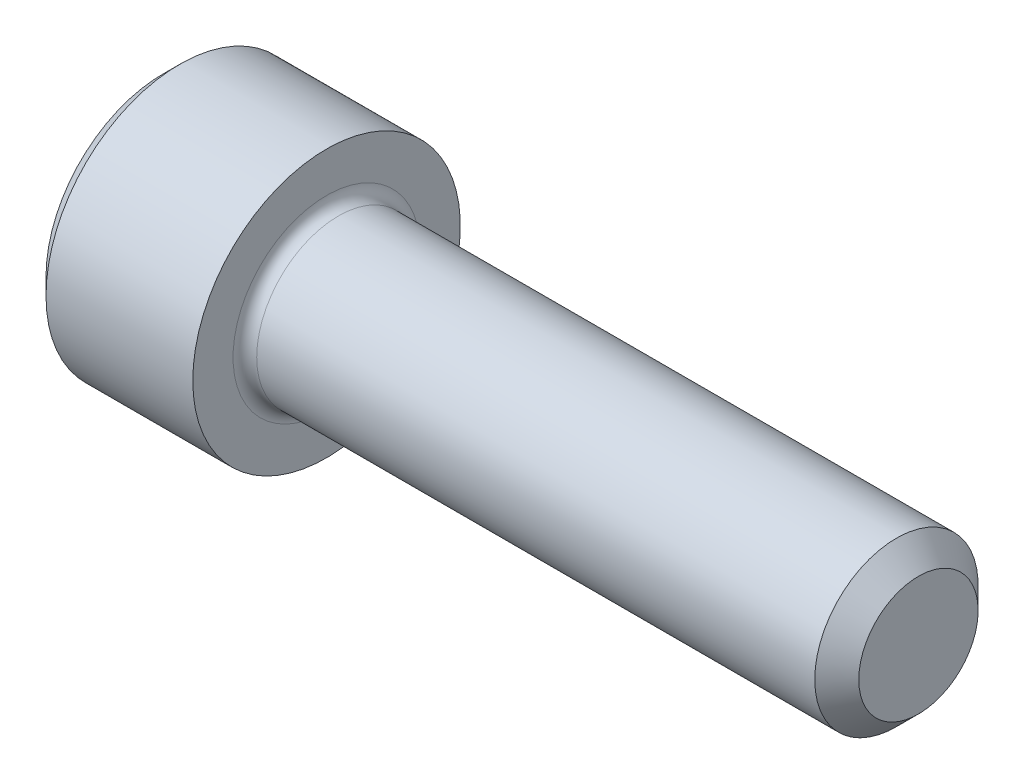
ISO-10303-21;
HEADER;
FILE_DESCRIPTION(('STEP AP214'),'2;1');
FILE_NAME('part.step','',(''),(''),'','','');
FILE_SCHEMA(('AUTOMOTIVE_DESIGN { 1 0 10303 214 1 1 1 1 }'));
ENDSEC;
DATA;
#1=APPLICATION_CONTEXT('core data for automotive mechanical design processes');
#2=APPLICATION_PROTOCOL_DEFINITION('international standard','automotive_design',2000,#1);
#3=PRODUCT_CONTEXT('',#1,'mechanical');
#4=PRODUCT('Part','Part','',(#3));
#5=PRODUCT_RELATED_PRODUCT_CATEGORY('part','',(#4));
#6=PRODUCT_DEFINITION_FORMATION('','',#4);
#7=PRODUCT_DEFINITION_CONTEXT('part definition',#1,'design');
#8=PRODUCT_DEFINITION('design','',#6,#7);
#9=PRODUCT_DEFINITION_SHAPE('','',#8);
#10=(LENGTH_UNIT() NAMED_UNIT(*) SI_UNIT(.MILLI.,.METRE.));
#11=(NAMED_UNIT(*) PLANE_ANGLE_UNIT() SI_UNIT($,.RADIAN.));
#12=(NAMED_UNIT(*) SI_UNIT($,.STERADIAN.) SOLID_ANGLE_UNIT());
#13=UNCERTAINTY_MEASURE_WITH_UNIT(LENGTH_MEASURE(1.E-05),#10,'distance_accuracy_value','');
#14=(GEOMETRIC_REPRESENTATION_CONTEXT(3) GLOBAL_UNCERTAINTY_ASSIGNED_CONTEXT((#13)) GLOBAL_UNIT_ASSIGNED_CONTEXT((#10,
#11,#12)) REPRESENTATION_CONTEXT('',''));
#15=CARTESIAN_POINT('',(0.,0.,0.));
#16=DIRECTION('',(0.,0.,1.));
#17=DIRECTION('',(1.,0.,0.));
#18=AXIS2_PLACEMENT_3D('',#15,#16,#17);
#19=CARTESIAN_POINT('',(0.,0.,0.));
#20=DIRECTION('',(-1.,0.,0.));
#21=DIRECTION('',(0.,0.,1.));
#22=AXIS2_PLACEMENT_3D('',#19,#20,#21);
#23=PLANE('',#22);
#24=DIRECTION('',(0.,-0.499999999999999,0.866025403784439));
#25=VECTOR('',#24,1.);
#26=CARTESIAN_POINT('',(0.,1.5984519552784,0.));
#27=LINE('',#26,#25);
#28=CARTESIAN_POINT('',(0.,1.5984519552784,0.));
#29=VERTEX_POINT('',#28);
#30=CARTESIAN_POINT('',(0.,0.799225977639205,1.3843));
#31=VERTEX_POINT('',#30);
#32=EDGE_CURVE('E263',#29,#31,#27,.T.);
#33=ORIENTED_EDGE('',*,*,#32,.T.);
#34=DIRECTION('',(0.,1.,0.));
#35=VECTOR('',#34,1.);
#36=CARTESIAN_POINT('',(0.,-0.799225977639191,1.3843));
#37=LINE('',#36,#35);
#38=CARTESIAN_POINT('',(0.,-0.799225977639191,1.3843));
#39=VERTEX_POINT('',#38);
#40=EDGE_CURVE('E134',#39,#31,#37,.T.);
#41=ORIENTED_EDGE('',*,*,#40,.F.);
#42=DIRECTION('',(0.,-0.500000000000001,-0.866025403784438));
#43=VECTOR('',#42,1.);
#44=CARTESIAN_POINT('',(0.,-0.799225977639191,1.3843));
#45=LINE('',#44,#43);
#46=CARTESIAN_POINT('',(0.,-1.59845195527839,0.));
#47=VERTEX_POINT('',#46);
#48=EDGE_CURVE('E266',#39,#47,#45,.T.);
#49=ORIENTED_EDGE('',*,*,#48,.T.);
#50=DIRECTION('',(0.,0.499999999999999,-0.86602540378444));
#51=VECTOR('',#50,1.);
#52=CARTESIAN_POINT('',(0.,-1.59845195527839,0.));
#53=LINE('',#52,#51);
#54=CARTESIAN_POINT('',(0.,-0.799225977639196,-1.3843));
#55=VERTEX_POINT('',#54);
#56=EDGE_CURVE('E269',#47,#55,#53,.T.);
#57=ORIENTED_EDGE('',*,*,#56,.T.);
#58=DIRECTION('',(0.,-1.,0.));
#59=VECTOR('',#58,1.);
#60=CARTESIAN_POINT('',(0.,0.799225977639202,-1.3843));
#61=LINE('',#60,#59);
#62=CARTESIAN_POINT('',(0.,0.799225977639202,-1.3843));
#63=VERTEX_POINT('',#62);
#64=EDGE_CURVE('E272',#63,#55,#61,.T.);
#65=ORIENTED_EDGE('',*,*,#64,.F.);
#66=DIRECTION('',(0.,-0.500000000000001,-0.866025403784438));
#67=VECTOR('',#66,1.);
#68=CARTESIAN_POINT('',(0.,1.5984519552784,0.));
#69=LINE('',#68,#67);
#70=EDGE_CURVE('E129',#29,#63,#69,.T.);
#71=ORIENTED_EDGE('',*,*,#70,.F.);
#72=EDGE_LOOP('',(#33,#41,#49,#57,#65,#71));
#73=FACE_BOUND('',#72,.T.);
#74=CARTESIAN_POINT('',(0.,0.,0.));
#75=DIRECTION('',(-1.,0.,0.));
#76=DIRECTION('',(0.,0.,1.));
#77=AXIS2_PLACEMENT_3D('',#74,#75,#76);
#78=CIRCLE('',#77,2.51460000000001);
#79=CARTESIAN_POINT('',(0.,0.,2.51460000000001));
#80=VERTEX_POINT('',#79);
#81=EDGE_CURVE('E158',#80,#80,#78,.T.);
#82=ORIENTED_EDGE('',*,*,#81,.T.);
#83=EDGE_LOOP('',(#82));
#84=FACE_BOUND('',#83,.T.);
#85=ADVANCED_FACE('F38',(#73,#84),#23,.T.);
#86=CARTESIAN_POINT('',(0.,0.,0.));
#87=DIRECTION('',(1.,0.,0.));
#88=DIRECTION('',(0.,0.,-1.));
#89=AXIS2_PLACEMENT_3D('',#86,#87,#88);
#90=CONICAL_SURFACE('',#89,2.51460000000001,0.785398163397436);
#91=CARTESIAN_POINT('',(0.355600000000005,0.,0.));
#92=DIRECTION('',(-1.,0.,0.));
#93=DIRECTION('',(0.,0.,1.));
#94=AXIS2_PLACEMENT_3D('',#91,#92,#93);
#95=CIRCLE('',#94,2.8702);
#96=CARTESIAN_POINT('',(0.355600000000005,0.,2.8702));
#97=VERTEX_POINT('',#96);
#98=EDGE_CURVE('E155',#97,#97,#95,.T.);
#99=ORIENTED_EDGE('',*,*,#98,.T.);
#100=EDGE_LOOP('',(#99));
#101=FACE_BOUND('',#100,.T.);
#102=ORIENTED_EDGE('',*,*,#81,.F.);
#103=EDGE_LOOP('',(#102));
#104=FACE_BOUND('',#103,.T.);
#105=ADVANCED_FACE('F179',(#101,#104),#90,.T.);
#106=CARTESIAN_POINT('',(-31.75,0.,0.));
#107=DIRECTION('',(-1.,0.,0.));
#108=DIRECTION('',(0.,0.,1.));
#109=AXIS2_PLACEMENT_3D('',#106,#107,#108);
#110=CYLINDRICAL_SURFACE('',#109,2.8702);
#111=CARTESIAN_POINT('',(3.5052,0.,0.));
#112=DIRECTION('',(-1.,0.,0.));
#113=DIRECTION('',(0.,0.,1.));
#114=AXIS2_PLACEMENT_3D('',#111,#112,#113);
#115=CIRCLE('',#114,2.8702);
#116=CARTESIAN_POINT('',(3.5052,0.,2.8702));
#117=VERTEX_POINT('',#116);
#118=EDGE_CURVE('E152',#117,#117,#115,.T.);
#119=ORIENTED_EDGE('',*,*,#118,.T.);
#120=EDGE_LOOP('',(#119));
#121=FACE_BOUND('',#120,.T.);
#122=ORIENTED_EDGE('',*,*,#98,.F.);
#123=EDGE_LOOP('',(#122));
#124=FACE_BOUND('',#123,.T.);
#125=ADVANCED_FACE('F184',(#121,#124),#110,.T.);
#126=CARTESIAN_POINT('',(3.5052,2.8702,0.));
#127=DIRECTION('',(1.,0.,0.));
#128=DIRECTION('',(0.,0.,-1.));
#129=AXIS2_PLACEMENT_3D('',#126,#127,#128);
#130=PLANE('',#129);
#131=CARTESIAN_POINT('',(3.5052,0.,0.));
#132=DIRECTION('',(1.,0.,0.));
#133=DIRECTION('',(0.,0.,-1.));
#134=AXIS2_PLACEMENT_3D('',#131,#132,#133);
#135=CIRCLE('',#134,2.0066);
#136=CARTESIAN_POINT('',(3.5052,0.,-2.0066));
#137=VERTEX_POINT('',#136);
#138=EDGE_CURVE('E46',#137,#137,#135,.F.);
#139=ORIENTED_EDGE('',*,*,#138,.T.);
#140=EDGE_LOOP('',(#139));
#141=FACE_BOUND('',#140,.T.);
#142=ORIENTED_EDGE('',*,*,#118,.F.);
#143=EDGE_LOOP('',(#142));
#144=FACE_BOUND('',#143,.T.);
#145=ADVANCED_FACE('F163',(#141,#144),#130,.T.);
#146=CARTESIAN_POINT('',(-31.75,0.,0.));
#147=DIRECTION('',(-1.,0.,0.));
#148=DIRECTION('',(0.,0.,1.));
#149=AXIS2_PLACEMENT_3D('',#146,#147,#148);
#150=CYLINDRICAL_SURFACE('',#149,1.7526);
#151=CARTESIAN_POINT('',(3.7592,0.,0.));
#152=DIRECTION('',(1.,0.,0.));
#153=DIRECTION('',(0.,0.,-1.));
#154=AXIS2_PLACEMENT_3D('',#151,#152,#153);
#155=CIRCLE('',#154,1.7526);
#156=CARTESIAN_POINT('',(3.7592,0.,-1.7526));
#157=VERTEX_POINT('',#156);
#158=EDGE_CURVE('E11',#157,#157,#155,.T.);
#159=ORIENTED_EDGE('',*,*,#158,.T.);
#160=EDGE_LOOP('',(#159));
#161=FACE_BOUND('',#160,.T.);
#162=CARTESIAN_POINT('',(15.73276,0.,0.));
#163=DIRECTION('',(-1.,0.,0.));
#164=DIRECTION('',(0.,0.,1.));
#165=AXIS2_PLACEMENT_3D('',#162,#163,#164);
#166=CIRCLE('',#165,1.7526);
#167=CARTESIAN_POINT('',(15.73276,0.,1.7526));
#168=VERTEX_POINT('',#167);
#169=EDGE_CURVE('E149',#168,#168,#166,.T.);
#170=ORIENTED_EDGE('',*,*,#169,.T.);
#171=EDGE_LOOP('',(#170));
#172=FACE_BOUND('',#171,.T.);
#173=ADVANCED_FACE('F194',(#161,#172),#150,.T.);
#174=CARTESIAN_POINT('',(16.2052,0.,0.));
#175=DIRECTION('',(-1.,0.,0.));
#176=DIRECTION('',(0.,0.,1.));
#177=AXIS2_PLACEMENT_3D('',#174,#175,#176);
#178=CONICAL_SURFACE('',#177,1.28016,0.785398163397457);
#179=ORIENTED_EDGE('',*,*,#169,.F.);
#180=EDGE_LOOP('',(#179));
#181=FACE_BOUND('',#180,.T.);
#182=CARTESIAN_POINT('',(16.2052,0.,0.));
#183=DIRECTION('',(-1.,0.,0.));
#184=DIRECTION('',(0.,0.,1.));
#185=AXIS2_PLACEMENT_3D('',#182,#183,#184);
#186=CIRCLE('',#185,1.28016);
#187=CARTESIAN_POINT('',(16.2052,0.,1.28016));
#188=VERTEX_POINT('',#187);
#189=EDGE_CURVE('E145',#188,#188,#186,.T.);
#190=ORIENTED_EDGE('',*,*,#189,.T.);
#191=EDGE_LOOP('',(#190));
#192=FACE_BOUND('',#191,.T.);
#193=ADVANCED_FACE('F174',(#181,#192),#178,.T.);
#194=CARTESIAN_POINT('',(16.2052,1.28016,0.));
#195=DIRECTION('',(1.,0.,0.));
#196=DIRECTION('',(0.,0.,-1.));
#197=AXIS2_PLACEMENT_3D('',#194,#195,#196);
#198=PLANE('',#197);
#199=ORIENTED_EDGE('',*,*,#189,.F.);
#200=EDGE_LOOP('',(#199));
#201=FACE_BOUND('',#200,.T.);
#202=ADVANCED_FACE('F167',(#201),#198,.T.);
#203=CARTESIAN_POINT('',(3.7592,0.,0.));
#204=DIRECTION('',(1.,0.,0.));
#205=DIRECTION('',(0.,0.,-1.));
#206=AXIS2_PLACEMENT_3D('',#203,#204,#205);
#207=TOROIDAL_SURFACE('',#206,2.0066,0.254);
#208=ORIENTED_EDGE('',*,*,#158,.F.);
#209=EDGE_LOOP('',(#208));
#210=FACE_BOUND('',#209,.T.);
#211=ORIENTED_EDGE('',*,*,#138,.F.);
#212=EDGE_LOOP('',(#211));
#213=FACE_BOUND('',#212,.T.);
#214=ADVANCED_FACE('F40',(#210,#213),#207,.F.);
#215=CARTESIAN_POINT('',(1.6256,1.5984519552784,0.));
#216=DIRECTION('',(0.,-0.866025403784439,-0.499999999999999));
#217=DIRECTION('',(0.,0.499999999999999,-0.866025403784439));
#218=AXIS2_PLACEMENT_3D('',#215,#216,#217);
#219=PLANE('',#218);
#220=ORIENTED_EDGE('',*,*,#32,.F.);
#221=DIRECTION('',(-1.,0.,0.));
#222=VECTOR('',#221,1.);
#223=CARTESIAN_POINT('',(1.6256,1.5984519552784,0.));
#224=LINE('',#223,#222);
#225=CARTESIAN_POINT('',(1.6256,1.5984519552784,0.));
#226=VERTEX_POINT('',#225);
#227=EDGE_CURVE('E253',#226,#29,#224,.T.);
#228=ORIENTED_EDGE('',*,*,#227,.F.);
#229=DIRECTION('',(0.,-0.499999999999999,0.866025403784439));
#230=VECTOR('',#229,1.);
#231=CARTESIAN_POINT('',(1.6256,1.5984519552784,0.));
#232=LINE('',#231,#230);
#233=CARTESIAN_POINT('',(1.6256,1.1988389664588,0.692150000000001));
#234=VERTEX_POINT('',#233);
#235=EDGE_CURVE('E121',#226,#234,#232,.T.);
#236=ORIENTED_EDGE('',*,*,#235,.T.);
#237=CARTESIAN_POINT('',(1.6256,0.799225977639205,1.3843));
#238=VERTEX_POINT('',#237);
#239=EDGE_CURVE('E112',#234,#238,#232,.T.);
#240=ORIENTED_EDGE('',*,*,#239,.T.);
#241=DIRECTION('',(-1.,0.,0.));
#242=VECTOR('',#241,1.);
#243=CARTESIAN_POINT('',(1.6256,0.799225977639205,1.3843));
#244=LINE('',#243,#242);
#245=EDGE_CURVE('E126',#238,#31,#244,.T.);
#246=ORIENTED_EDGE('',*,*,#245,.T.);
#247=EDGE_LOOP('',(#220,#228,#236,#240,#246));
#248=FACE_BOUND('',#247,.T.);
#249=ADVANCED_FACE('F125',(#248),#219,.T.);
#250=CARTESIAN_POINT('',(1.6256,-0.799225977639191,1.3843));
#251=DIRECTION('',(0.,0.,1.));
#252=DIRECTION('',(0.,-1.,0.));
#253=AXIS2_PLACEMENT_3D('',#250,#251,#252);
#254=PLANE('',#253);
#255=ORIENTED_EDGE('',*,*,#40,.T.);
#256=ORIENTED_EDGE('',*,*,#245,.F.);
#257=DIRECTION('',(0.,1.,0.));
#258=VECTOR('',#257,1.);
#259=CARTESIAN_POINT('',(1.6256,-0.799225977639191,1.3843));
#260=LINE('',#259,#258);
#261=CARTESIAN_POINT('',(1.6256,0.,1.3843));
#262=VERTEX_POINT('',#261);
#263=EDGE_CURVE('E109',#262,#238,#260,.T.);
#264=ORIENTED_EDGE('',*,*,#263,.F.);
#265=CARTESIAN_POINT('',(1.6256,-0.799225977639191,1.3843));
#266=VERTEX_POINT('',#265);
#267=EDGE_CURVE('E120',#266,#262,#260,.T.);
#268=ORIENTED_EDGE('',*,*,#267,.F.);
#269=DIRECTION('',(-1.,0.,0.));
#270=VECTOR('',#269,1.);
#271=CARTESIAN_POINT('',(1.6256,-0.799225977639191,1.3843));
#272=LINE('',#271,#270);
#273=EDGE_CURVE('E136',#266,#39,#272,.T.);
#274=ORIENTED_EDGE('',*,*,#273,.T.);
#275=EDGE_LOOP('',(#255,#256,#264,#268,#274));
#276=FACE_BOUND('',#275,.T.);
#277=ADVANCED_FACE('F131',(#276),#254,.F.);
#278=CARTESIAN_POINT('',(1.6256,-0.799225977639191,1.3843));
#279=DIRECTION('',(0.,0.866025403784438,-0.500000000000001));
#280=DIRECTION('',(0.,0.500000000000001,0.866025403784438));
#281=AXIS2_PLACEMENT_3D('',#278,#279,#280);
#282=PLANE('',#281);
#283=ORIENTED_EDGE('',*,*,#48,.F.);
#284=ORIENTED_EDGE('',*,*,#273,.F.);
#285=DIRECTION('',(0.,-0.500000000000001,-0.866025403784438));
#286=VECTOR('',#285,1.);
#287=CARTESIAN_POINT('',(1.6256,-0.799225977639191,1.3843));
#288=LINE('',#287,#286);
#289=CARTESIAN_POINT('',(1.6256,-1.19883896645879,0.692149999999999));
#290=VERTEX_POINT('',#289);
#291=EDGE_CURVE('E292',#266,#290,#288,.T.);
#292=ORIENTED_EDGE('',*,*,#291,.T.);
#293=CARTESIAN_POINT('',(1.6256,-1.59845195527839,0.));
#294=VERTEX_POINT('',#293);
#295=EDGE_CURVE('E281',#290,#294,#288,.T.);
#296=ORIENTED_EDGE('',*,*,#295,.T.);
#297=DIRECTION('',(-1.,0.,0.));
#298=VECTOR('',#297,1.);
#299=CARTESIAN_POINT('',(1.6256,-1.59845195527839,0.));
#300=LINE('',#299,#298);
#301=EDGE_CURVE('E141',#294,#47,#300,.T.);
#302=ORIENTED_EDGE('',*,*,#301,.T.);
#303=EDGE_LOOP('',(#283,#284,#292,#296,#302));
#304=FACE_BOUND('',#303,.T.);
#305=ADVANCED_FACE('F207',(#304),#282,.T.);
#306=CARTESIAN_POINT('',(1.6256,-1.59845195527839,0.));
#307=DIRECTION('',(0.,0.866025403784439,0.499999999999999));
#308=DIRECTION('',(0.,-0.499999999999999,0.866025403784439));
#309=AXIS2_PLACEMENT_3D('',#306,#307,#308);
#310=PLANE('',#309);
#311=ORIENTED_EDGE('',*,*,#56,.F.);
#312=ORIENTED_EDGE('',*,*,#301,.F.);
#313=DIRECTION('',(0.,0.499999999999999,-0.86602540378444));
#314=VECTOR('',#313,1.);
#315=CARTESIAN_POINT('',(1.6256,-1.59845195527839,0.));
#316=LINE('',#315,#314);
#317=CARTESIAN_POINT('',(1.6256,-1.1988389664588,-0.692149999999996));
#318=VERTEX_POINT('',#317);
#319=EDGE_CURVE('E259',#294,#318,#316,.T.);
#320=ORIENTED_EDGE('',*,*,#319,.T.);
#321=CARTESIAN_POINT('',(1.6256,-0.799225977639196,-1.3843));
#322=VERTEX_POINT('',#321);
#323=EDGE_CURVE('E291',#318,#322,#316,.T.);
#324=ORIENTED_EDGE('',*,*,#323,.T.);
#325=DIRECTION('',(-1.,0.,0.));
#326=VECTOR('',#325,1.);
#327=CARTESIAN_POINT('',(1.6256,-0.799225977639196,-1.3843));
#328=LINE('',#327,#326);
#329=EDGE_CURVE('E252',#322,#55,#328,.T.);
#330=ORIENTED_EDGE('',*,*,#329,.T.);
#331=EDGE_LOOP('',(#311,#312,#320,#324,#330));
#332=FACE_BOUND('',#331,.T.);
#333=ADVANCED_FACE('F210',(#332),#310,.T.);
#334=CARTESIAN_POINT('',(1.6256,0.799225977639202,-1.3843));
#335=DIRECTION('',(0.,0.,-1.));
#336=DIRECTION('',(0.,1.,0.));
#337=AXIS2_PLACEMENT_3D('',#334,#335,#336);
#338=PLANE('',#337);
#339=ORIENTED_EDGE('',*,*,#64,.T.);
#340=ORIENTED_EDGE('',*,*,#329,.F.);
#341=DIRECTION('',(0.,-1.,0.));
#342=VECTOR('',#341,1.);
#343=CARTESIAN_POINT('',(1.6256,0.799225977639202,-1.3843));
#344=LINE('',#343,#342);
#345=CARTESIAN_POINT('',(1.6256,0.,-1.3843));
#346=VERTEX_POINT('',#345);
#347=EDGE_CURVE('E256',#346,#322,#344,.T.);
#348=ORIENTED_EDGE('',*,*,#347,.F.);
#349=CARTESIAN_POINT('',(1.6256,0.799225977639202,-1.3843));
#350=VERTEX_POINT('',#349);
#351=EDGE_CURVE('E53',#350,#346,#344,.T.);
#352=ORIENTED_EDGE('',*,*,#351,.F.);
#353=DIRECTION('',(-1.,0.,0.));
#354=VECTOR('',#353,1.);
#355=CARTESIAN_POINT('',(1.6256,0.799225977639202,-1.3843));
#356=LINE('',#355,#354);
#357=EDGE_CURVE('E249',#350,#63,#356,.T.);
#358=ORIENTED_EDGE('',*,*,#357,.T.);
#359=EDGE_LOOP('',(#339,#340,#348,#352,#358));
#360=FACE_BOUND('',#359,.T.);
#361=ADVANCED_FACE('F214',(#360),#338,.F.);
#362=CARTESIAN_POINT('',(1.6256,1.5984519552784,0.));
#363=DIRECTION('',(0.,0.866025403784438,-0.500000000000001));
#364=DIRECTION('',(0.,0.500000000000001,0.866025403784438));
#365=AXIS2_PLACEMENT_3D('',#362,#363,#364);
#366=PLANE('',#365);
#367=ORIENTED_EDGE('',*,*,#70,.T.);
#368=ORIENTED_EDGE('',*,*,#357,.F.);
#369=DIRECTION('',(0.,-0.500000000000001,-0.866025403784438));
#370=VECTOR('',#369,1.);
#371=CARTESIAN_POINT('',(1.6256,1.5984519552784,0.));
#372=LINE('',#371,#370);
#373=CARTESIAN_POINT('',(1.6256,1.1988389664588,-0.692150000000004));
#374=VERTEX_POINT('',#373);
#375=EDGE_CURVE('E239',#374,#350,#372,.T.);
#376=ORIENTED_EDGE('',*,*,#375,.F.);
#377=EDGE_CURVE('E245',#226,#374,#372,.T.);
#378=ORIENTED_EDGE('',*,*,#377,.F.);
#379=ORIENTED_EDGE('',*,*,#227,.T.);
#380=EDGE_LOOP('',(#367,#368,#376,#378,#379));
#381=FACE_BOUND('',#380,.T.);
#382=ADVANCED_FACE('F218',(#381),#366,.F.);
#383=CARTESIAN_POINT('',(1.6256,0.,2.7686));
#384=DIRECTION('',(1.,0.,0.));
#385=DIRECTION('',(0.,0.,-1.));
#386=AXIS2_PLACEMENT_3D('',#383,#384,#385);
#387=PLANE('',#386);
#388=ORIENTED_EDGE('',*,*,#347,.T.);
#389=ORIENTED_EDGE('',*,*,#323,.F.);
#390=CARTESIAN_POINT('',(1.6256,0.,0.));
#391=DIRECTION('',(-1.,0.,0.));
#392=DIRECTION('',(0.,0.,1.));
#393=AXIS2_PLACEMENT_3D('',#390,#391,#392);
#394=CIRCLE('',#393,1.3843);
#395=EDGE_CURVE('E287',#346,#318,#394,.T.);
#396=ORIENTED_EDGE('',*,*,#395,.F.);
#397=EDGE_LOOP('',(#388,#389,#396));
#398=FACE_BOUND('',#397,.T.);
#399=ADVANCED_FACE('F222',(#398),#387,.F.);
#400=ORIENTED_EDGE('',*,*,#319,.F.);
#401=ORIENTED_EDGE('',*,*,#295,.F.);
#402=EDGE_CURVE('E139',#318,#290,#394,.T.);
#403=ORIENTED_EDGE('',*,*,#402,.F.);
#404=EDGE_LOOP('',(#400,#401,#403));
#405=FACE_BOUND('',#404,.T.);
#406=ADVANCED_FACE('F225',(#405),#387,.F.);
#407=ORIENTED_EDGE('',*,*,#291,.F.);
#408=ORIENTED_EDGE('',*,*,#267,.T.);
#409=EDGE_CURVE('E135',#290,#262,#394,.T.);
#410=ORIENTED_EDGE('',*,*,#409,.F.);
#411=EDGE_LOOP('',(#407,#408,#410));
#412=FACE_BOUND('',#411,.T.);
#413=ADVANCED_FACE('F230',(#412),#387,.F.);
#414=ORIENTED_EDGE('',*,*,#263,.T.);
#415=ORIENTED_EDGE('',*,*,#239,.F.);
#416=EDGE_CURVE('E115',#262,#234,#394,.T.);
#417=ORIENTED_EDGE('',*,*,#416,.F.);
#418=EDGE_LOOP('',(#414,#415,#417));
#419=FACE_BOUND('',#418,.T.);
#420=ADVANCED_FACE('F111',(#419),#387,.F.);
#421=ORIENTED_EDGE('',*,*,#235,.F.);
#422=ORIENTED_EDGE('',*,*,#377,.T.);
#423=EDGE_CURVE('E146',#234,#374,#394,.T.);
#424=ORIENTED_EDGE('',*,*,#423,.F.);
#425=EDGE_LOOP('',(#421,#422,#424));
#426=FACE_BOUND('',#425,.T.);
#427=ADVANCED_FACE('F233',(#426),#387,.F.);
#428=ORIENTED_EDGE('',*,*,#375,.T.);
#429=ORIENTED_EDGE('',*,*,#351,.T.);
#430=EDGE_CURVE('E242',#374,#346,#394,.T.);
#431=ORIENTED_EDGE('',*,*,#430,.F.);
#432=EDGE_LOOP('',(#428,#429,#431));
#433=FACE_BOUND('',#432,.T.);
#434=ADVANCED_FACE('F203',(#433),#387,.F.);
#435=CARTESIAN_POINT('',(1.6256,0.,0.));
#436=DIRECTION('',(-1.,0.,0.));
#437=DIRECTION('',(0.,0.,1.));
#438=AXIS2_PLACEMENT_3D('',#435,#436,#437);
#439=CONICAL_SURFACE('',#438,1.3843,1.04719755119659);
#440=CARTESIAN_POINT('',(2.4248259776392,0.,0.));
#441=VERTEX_POINT('',#440);
#442=VERTEX_LOOP('',#441);
#443=FACE_BOUND('',#442,.T.);
#444=ORIENTED_EDGE('',*,*,#416,.T.);
#445=ORIENTED_EDGE('',*,*,#423,.T.);
#446=ORIENTED_EDGE('',*,*,#430,.T.);
#447=ORIENTED_EDGE('',*,*,#395,.T.);
#448=ORIENTED_EDGE('',*,*,#402,.T.);
#449=ORIENTED_EDGE('',*,*,#409,.T.);
#450=EDGE_LOOP('',(#444,#445,#446,#447,#448,#449));
#451=FACE_BOUND('',#450,.T.);
#452=ADVANCED_FACE('F201',(#443,#451),#439,.F.);
#453=CLOSED_SHELL('',(#85,#105,#125,#145,#173,#193,#202,#214,#249,#277,#305,#333,#361,#382,#399,
#406,#413,#420,#427,#434,#452));
#454=MANIFOLD_SOLID_BREP('B2',#453);
#455=ADVANCED_BREP_SHAPE_REPRESENTATION('',(#18,#454),#14);
#456=SHAPE_DEFINITION_REPRESENTATION(#9,#455);
ENDSEC;
END-ISO-10303-21;
